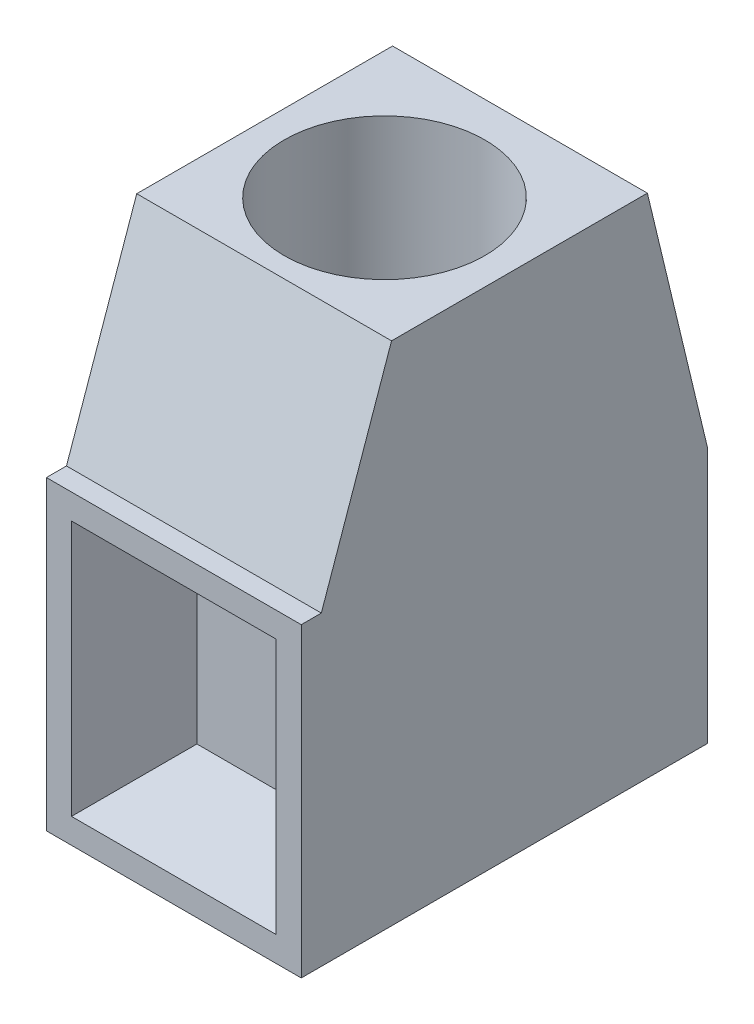
ISO-10303-21;
HEADER;
FILE_DESCRIPTION(('STEP AP214'),'2;1');
FILE_NAME('part.step','',(''),(''),'','','');
FILE_SCHEMA(('AUTOMOTIVE_DESIGN { 1 0 10303 214 1 1 1 1 }'));
ENDSEC;
DATA;
#1=APPLICATION_CONTEXT('core data for automotive mechanical design processes');
#2=APPLICATION_PROTOCOL_DEFINITION('international standard','automotive_design',2000,#1);
#3=PRODUCT_CONTEXT('',#1,'mechanical');
#4=PRODUCT('Part','Part','',(#3));
#5=PRODUCT_RELATED_PRODUCT_CATEGORY('part','',(#4));
#6=PRODUCT_DEFINITION_FORMATION('','',#4);
#7=PRODUCT_DEFINITION_CONTEXT('part definition',#1,'design');
#8=PRODUCT_DEFINITION('design','',#6,#7);
#9=PRODUCT_DEFINITION_SHAPE('','',#8);
#10=(LENGTH_UNIT() NAMED_UNIT(*) SI_UNIT(.MILLI.,.METRE.));
#11=(NAMED_UNIT(*) PLANE_ANGLE_UNIT() SI_UNIT($,.RADIAN.));
#12=(NAMED_UNIT(*) SI_UNIT($,.STERADIAN.) SOLID_ANGLE_UNIT());
#13=UNCERTAINTY_MEASURE_WITH_UNIT(LENGTH_MEASURE(1.E-05),#10,'distance_accuracy_value','');
#14=(GEOMETRIC_REPRESENTATION_CONTEXT(3) GLOBAL_UNCERTAINTY_ASSIGNED_CONTEXT((#13)) GLOBAL_UNIT_ASSIGNED_CONTEXT((#10,
#11,#12)) REPRESENTATION_CONTEXT('',''));
#15=CARTESIAN_POINT('',(0.,0.,0.));
#16=DIRECTION('',(0.,0.,1.));
#17=DIRECTION('',(1.,0.,0.));
#18=AXIS2_PLACEMENT_3D('',#15,#16,#17);
#19=CARTESIAN_POINT('',(2.54,6.1,-4.2));
#20=DIRECTION('',(0.,1.,0.));
#21=DIRECTION('',(0.,0.,1.));
#22=AXIS2_PLACEMENT_3D('',#19,#20,#21);
#23=PLANE('',#22);
#24=CARTESIAN_POINT('',(2.54,6.1,-4.2));
#25=DIRECTION('',(0.,-1.,0.));
#26=DIRECTION('',(0.,0.,-1.));
#27=AXIS2_PLACEMENT_3D('',#24,#25,#26);
#28=CIRCLE('',#27,1.9);
#29=CARTESIAN_POINT('',(3.42241293779472,6.1,-2.51733918830556));
#30=VERTEX_POINT('',#29);
#31=CARTESIAN_POINT('',(4.1545907069124,6.1,-3.1984527723799));
#32=VERTEX_POINT('',#31);
#33=EDGE_CURVE('E156',#30,#32,#28,.F.);
#34=ORIENTED_EDGE('',*,*,#33,.T.);
#35=DIRECTION('',(-0.681113584074246,0.,-0.732177769117265));
#36=VECTOR('',#35,1.);
#37=CARTESIAN_POINT('',(1.657587062206,6.1,-5.882660811695));
#38=LINE('',#37,#36);
#39=CARTESIAN_POINT('',(1.65758706220603,6.1,-5.88266081169497));
#40=VERTEX_POINT('',#39);
#41=EDGE_CURVE('E160',#32,#40,#38,.T.);
#42=ORIENTED_EDGE('',*,*,#41,.T.);
#43=CARTESIAN_POINT('',(2.54,6.1,-4.2));
#44=DIRECTION('',(0.,-1.,0.));
#45=DIRECTION('',(0.,0.,-1.));
#46=AXIS2_PLACEMENT_3D('',#43,#44,#45);
#47=CIRCLE('',#46,1.9);
#48=CARTESIAN_POINT('',(0.925409293088177,6.1,-5.20154722762081));
#49=VERTEX_POINT('',#48);
#50=EDGE_CURVE('E19',#40,#49,#47,.F.);
#51=ORIENTED_EDGE('',*,*,#50,.T.);
#52=DIRECTION('',(0.681113584074246,0.,0.732177769117265));
#53=VECTOR('',#52,1.);
#54=CARTESIAN_POINT('',(0.925409293088,6.1,-5.201547227621));
#55=LINE('',#54,#53);
#56=EDGE_CURVE('E173',#49,#30,#55,.T.);
#57=ORIENTED_EDGE('',*,*,#56,.T.);
#58=EDGE_LOOP('',(#34,#42,#51,#57));
#59=FACE_BOUND('',#58,.T.);
#60=ADVANCED_FACE('F16',(#59),#23,.T.);
#61=CARTESIAN_POINT('',(0.925409293088,6.1,-5.201547227621));
#62=DIRECTION('',(-0.732177769117265,0.,0.681113584074246));
#63=DIRECTION('',(0.681113584074246,0.,0.732177769117265));
#64=AXIS2_PLACEMENT_3D('',#61,#62,#63);
#65=PLANE('',#64);
#66=DIRECTION('',(0.,1.,0.));
#67=VECTOR('',#66,1.);
#68=CARTESIAN_POINT('',(3.42241293779467,6.1,-2.51733918830562));
#69=LINE('',#68,#67);
#70=CARTESIAN_POINT('',(3.4224129377943,7.1,-2.51733918830534));
#71=VERTEX_POINT('',#70);
#72=EDGE_CURVE('E168',#30,#71,#69,.T.);
#73=ORIENTED_EDGE('',*,*,#72,.F.);
#74=ORIENTED_EDGE('',*,*,#56,.F.);
#75=DIRECTION('',(0.,1.,0.));
#76=VECTOR('',#75,1.);
#77=CARTESIAN_POINT('',(0.925409293088,6.1,-5.201547227621));
#78=LINE('',#77,#76);
#79=CARTESIAN_POINT('',(0.925409293088177,7.1,-5.20154722762081));
#80=VERTEX_POINT('',#79);
#81=EDGE_CURVE('E151',#80,#49,#78,.F.);
#82=ORIENTED_EDGE('',*,*,#81,.F.);
#83=DIRECTION('',(-0.681113584074065,0.,-0.732177769117433));
#84=VECTOR('',#83,1.);
#85=CARTESIAN_POINT('',(3.422412937794,7.1,-2.517339188305));
#86=LINE('',#85,#84);
#87=EDGE_CURVE('E164',#71,#80,#86,.T.);
#88=ORIENTED_EDGE('',*,*,#87,.F.);
#89=EDGE_LOOP('',(#73,#74,#82,#88));
#90=FACE_BOUND('',#89,.T.);
#91=ADVANCED_FACE('F208',(#90),#65,.F.);
#92=CARTESIAN_POINT('',(1.657587062206,6.1,-5.882660811695));
#93=DIRECTION('',(0.732177769117265,0.,-0.681113584074246));
#94=DIRECTION('',(-0.681113584074246,0.,-0.732177769117265));
#95=AXIS2_PLACEMENT_3D('',#92,#93,#94);
#96=PLANE('',#95);
#97=DIRECTION('',(0.,1.,0.));
#98=VECTOR('',#97,1.);
#99=CARTESIAN_POINT('',(1.657587062206,6.1,-5.882660811695));
#100=LINE('',#99,#98);
#101=CARTESIAN_POINT('',(1.65758706220603,7.1,-5.88266081169497));
#102=VERTEX_POINT('',#101);
#103=EDGE_CURVE('E148',#40,#102,#100,.T.);
#104=ORIENTED_EDGE('',*,*,#103,.F.);
#105=ORIENTED_EDGE('',*,*,#41,.F.);
#106=DIRECTION('',(0.,1.,0.));
#107=VECTOR('',#106,1.);
#108=CARTESIAN_POINT('',(4.15459070691266,6.1,-3.19845277237962));
#109=LINE('',#108,#107);
#110=CARTESIAN_POINT('',(4.15459070691216,7.1,-3.1984527723795));
#111=VERTEX_POINT('',#110);
#112=EDGE_CURVE('E166',#111,#32,#109,.F.);
#113=ORIENTED_EDGE('',*,*,#112,.F.);
#114=DIRECTION('',(0.681113584074065,0.,0.732177769117433));
#115=VECTOR('',#114,1.);
#116=CARTESIAN_POINT('',(1.657587062206,7.1,-5.882660811695));
#117=LINE('',#116,#115);
#118=EDGE_CURVE('E163',#102,#111,#117,.T.);
#119=ORIENTED_EDGE('',*,*,#118,.F.);
#120=EDGE_LOOP('',(#104,#105,#113,#119));
#121=FACE_BOUND('',#120,.T.);
#122=ADVANCED_FACE('F159',(#121),#96,.F.);
#123=CARTESIAN_POINT('',(2.54,7.1,-4.2));
#124=DIRECTION('',(0.,1.,0.));
#125=DIRECTION('',(0.,0.,1.));
#126=AXIS2_PLACEMENT_3D('',#123,#124,#125);
#127=PLANE('',#126);
#128=CARTESIAN_POINT('',(2.54,7.1,-4.2));
#129=DIRECTION('',(0.,-1.,0.));
#130=DIRECTION('',(0.,0.,-1.));
#131=AXIS2_PLACEMENT_3D('',#128,#129,#130);
#132=CIRCLE('',#131,1.9);
#133=EDGE_CURVE('E193',#71,#80,#132,.T.);
#134=ORIENTED_EDGE('',*,*,#133,.F.);
#135=ORIENTED_EDGE('',*,*,#87,.T.);
#136=EDGE_LOOP('',(#134,#135));
#137=FACE_BOUND('',#136,.T.);
#138=ADVANCED_FACE('F210',(#137),#127,.T.);
#139=CARTESIAN_POINT('',(2.54,7.1,-4.2));
#140=DIRECTION('',(0.,1.,0.));
#141=DIRECTION('',(0.,0.,1.));
#142=AXIS2_PLACEMENT_3D('',#139,#140,#141);
#143=PLANE('',#142);
#144=CARTESIAN_POINT('',(2.54,7.1,-4.2));
#145=DIRECTION('',(0.,-1.,0.));
#146=DIRECTION('',(0.,0.,-1.));
#147=AXIS2_PLACEMENT_3D('',#144,#145,#146);
#148=CIRCLE('',#147,1.9);
#149=EDGE_CURVE('E190',#102,#111,#148,.T.);
#150=ORIENTED_EDGE('',*,*,#149,.F.);
#151=ORIENTED_EDGE('',*,*,#118,.T.);
#152=EDGE_LOOP('',(#150,#151));
#153=FACE_BOUND('',#152,.T.);
#154=ADVANCED_FACE('F212',(#153),#143,.T.);
#155=CARTESIAN_POINT('',(2.09,-2.,-3.9));
#156=DIRECTION('',(1.,0.,0.));
#157=DIRECTION('',(0.,0.,-1.));
#158=AXIS2_PLACEMENT_3D('',#155,#156,#157);
#159=PLANE('',#158);
#160=DIRECTION('',(0.,1.,0.));
#161=VECTOR('',#160,1.);
#162=CARTESIAN_POINT('',(2.09,-2.,-4.5));
#163=LINE('',#162,#161);
#164=CARTESIAN_POINT('',(2.09,0.,-4.5));
#165=VERTEX_POINT('',#164);
#166=CARTESIAN_POINT('',(2.09,-2.,-4.5));
#167=VERTEX_POINT('',#166);
#168=EDGE_CURVE('E192',#165,#167,#163,.F.);
#169=ORIENTED_EDGE('',*,*,#168,.T.);
#170=DIRECTION('',(0.,0.,-1.));
#171=VECTOR('',#170,1.);
#172=CARTESIAN_POINT('',(2.09,-2.,0.));
#173=LINE('',#172,#171);
#174=CARTESIAN_POINT('',(2.09,-2.,-3.9));
#175=VERTEX_POINT('',#174);
#176=EDGE_CURVE('E316',#175,#167,#173,.T.);
#177=ORIENTED_EDGE('',*,*,#176,.F.);
#178=DIRECTION('',(0.,1.,0.));
#179=VECTOR('',#178,1.);
#180=CARTESIAN_POINT('',(2.09,-2.,-3.9));
#181=LINE('',#180,#179);
#182=CARTESIAN_POINT('',(2.09,0.,-3.9));
#183=VERTEX_POINT('',#182);
#184=EDGE_CURVE('E328',#175,#183,#181,.T.);
#185=ORIENTED_EDGE('',*,*,#184,.T.);
#186=DIRECTION('',(0.,0.,-1.));
#187=VECTOR('',#186,1.);
#188=CARTESIAN_POINT('',(2.09,0.,-3.9));
#189=LINE('',#188,#187);
#190=EDGE_CURVE('E194',#165,#183,#189,.F.);
#191=ORIENTED_EDGE('',*,*,#190,.F.);
#192=EDGE_LOOP('',(#169,#177,#185,#191));
#193=FACE_BOUND('',#192,.T.);
#194=ADVANCED_FACE('F219',(#193),#159,.F.);
#195=CARTESIAN_POINT('',(2.54,7.1,-4.2));
#196=DIRECTION('',(0.,-1.,0.));
#197=DIRECTION('',(0.,0.,-1.));
#198=AXIS2_PLACEMENT_3D('',#195,#196,#197);
#199=CYLINDRICAL_SURFACE('',#198,1.9);
#200=CARTESIAN_POINT('',(2.54,4.1,-4.2));
#201=DIRECTION('',(0.,-1.,0.));
#202=DIRECTION('',(0.,0.,-1.));
#203=AXIS2_PLACEMENT_3D('',#200,#201,#202);
#204=CIRCLE('',#203,1.9);
#205=CARTESIAN_POINT('',(2.54,4.1,-6.1));
#206=VERTEX_POINT('',#205);
#207=EDGE_CURVE('E185',#206,#206,#204,.T.);
#208=ORIENTED_EDGE('',*,*,#207,.F.);
#209=EDGE_LOOP('',(#208));
#210=FACE_BOUND('',#209,.T.);
#211=ORIENTED_EDGE('',*,*,#33,.F.);
#212=ORIENTED_EDGE('',*,*,#72,.T.);
#213=ORIENTED_EDGE('',*,*,#133,.T.);
#214=ORIENTED_EDGE('',*,*,#81,.T.);
#215=ORIENTED_EDGE('',*,*,#50,.F.);
#216=ORIENTED_EDGE('',*,*,#103,.T.);
#217=ORIENTED_EDGE('',*,*,#149,.T.);
#218=ORIENTED_EDGE('',*,*,#112,.T.);
#219=EDGE_LOOP('',(#211,#212,#213,#214,#215,#216,#217,#218));
#220=FACE_BOUND('',#219,.T.);
#221=ADVANCED_FACE('F146',(#210,#220),#199,.T.);
#222=CARTESIAN_POINT('',(0.,0.,-2.));
#223=DIRECTION('',(0.,0.,1.));
#224=DIRECTION('',(1.,0.,0.));
#225=AXIS2_PLACEMENT_3D('',#222,#223,#224);
#226=PLANE('',#225);
#227=DIRECTION('',(0.,1.,0.));
#228=VECTOR('',#227,1.);
#229=CARTESIAN_POINT('',(1.,0.,-2.));
#230=LINE('',#229,#228);
#231=CARTESIAN_POINT('',(1.,5.1,-2.));
#232=VERTEX_POINT('',#231);
#233=CARTESIAN_POINT('',(1.,1.,-2.));
#234=VERTEX_POINT('',#233);
#235=EDGE_CURVE('E359',#232,#234,#230,.F.);
#236=ORIENTED_EDGE('',*,*,#235,.T.);
#237=DIRECTION('',(1.,0.,0.));
#238=VECTOR('',#237,1.);
#239=CARTESIAN_POINT('',(0.,1.,-2.));
#240=LINE('',#239,#238);
#241=CARTESIAN_POINT('',(4.08,1.,-2.));
#242=VERTEX_POINT('',#241);
#243=EDGE_CURVE('E356',#234,#242,#240,.T.);
#244=ORIENTED_EDGE('',*,*,#243,.T.);
#245=DIRECTION('',(0.,1.,0.));
#246=VECTOR('',#245,1.);
#247=CARTESIAN_POINT('',(4.08,0.,-2.));
#248=LINE('',#247,#246);
#249=CARTESIAN_POINT('',(4.08,5.1,-2.));
#250=VERTEX_POINT('',#249);
#251=EDGE_CURVE('E350',#242,#250,#248,.T.);
#252=ORIENTED_EDGE('',*,*,#251,.T.);
#253=DIRECTION('',(1.,0.,0.));
#254=VECTOR('',#253,1.);
#255=CARTESIAN_POINT('',(0.,5.1,-2.));
#256=LINE('',#255,#254);
#257=EDGE_CURVE('E188',#250,#232,#256,.F.);
#258=ORIENTED_EDGE('',*,*,#257,.T.);
#259=EDGE_LOOP('',(#236,#244,#252,#258));
#260=FACE_BOUND('',#259,.T.);
#261=ADVANCED_FACE('F300',(#260),#226,.T.);
#262=CARTESIAN_POINT('',(2.09,-2.,-4.5));
#263=DIRECTION('',(0.,0.,1.));
#264=DIRECTION('',(1.,0.,0.));
#265=AXIS2_PLACEMENT_3D('',#262,#263,#264);
#266=PLANE('',#265);
#267=DIRECTION('',(0.,1.,0.));
#268=VECTOR('',#267,1.);
#269=CARTESIAN_POINT('',(2.99,-2.,-4.5));
#270=LINE('',#269,#268);
#271=CARTESIAN_POINT('',(2.99,0.,-4.5));
#272=VERTEX_POINT('',#271);
#273=CARTESIAN_POINT('',(2.99,-2.,-4.5));
#274=VERTEX_POINT('',#273);
#275=EDGE_CURVE('E322',#272,#274,#270,.F.);
#276=ORIENTED_EDGE('',*,*,#275,.T.);
#277=DIRECTION('',(1.,0.,0.));
#278=VECTOR('',#277,1.);
#279=CARTESIAN_POINT('',(0.,-2.,-4.5));
#280=LINE('',#279,#278);
#281=EDGE_CURVE('E320',#167,#274,#280,.T.);
#282=ORIENTED_EDGE('',*,*,#281,.F.);
#283=ORIENTED_EDGE('',*,*,#168,.F.);
#284=DIRECTION('',(1.,0.,0.));
#285=VECTOR('',#284,1.);
#286=CARTESIAN_POINT('',(2.09,0.,-4.5));
#287=LINE('',#286,#285);
#288=EDGE_CURVE('E318',#272,#165,#287,.F.);
#289=ORIENTED_EDGE('',*,*,#288,.F.);
#290=EDGE_LOOP('',(#276,#282,#283,#289));
#291=FACE_BOUND('',#290,.T.);
#292=ADVANCED_FACE('F296',(#291),#266,.F.);
#293=CARTESIAN_POINT('',(0.,-2.,0.));
#294=DIRECTION('',(0.,-1.,0.));
#295=DIRECTION('',(0.,0.,-1.));
#296=AXIS2_PLACEMENT_3D('',#293,#294,#295);
#297=PLANE('',#296);
#298=DIRECTION('',(0.,0.,1.));
#299=VECTOR('',#298,1.);
#300=CARTESIAN_POINT('',(2.99,-2.,-3.9));
#301=LINE('',#300,#299);
#302=CARTESIAN_POINT('',(2.99,-2.,-3.9));
#303=VERTEX_POINT('',#302);
#304=EDGE_CURVE('E337',#274,#303,#301,.T.);
#305=ORIENTED_EDGE('',*,*,#304,.T.);
#306=DIRECTION('',(-1.,0.,0.));
#307=VECTOR('',#306,1.);
#308=CARTESIAN_POINT('',(2.09,-2.,-3.9));
#309=LINE('',#308,#307);
#310=EDGE_CURVE('E325',#303,#175,#309,.T.);
#311=ORIENTED_EDGE('',*,*,#310,.T.);
#312=ORIENTED_EDGE('',*,*,#176,.T.);
#313=ORIENTED_EDGE('',*,*,#281,.T.);
#314=EDGE_LOOP('',(#305,#311,#312,#313));
#315=FACE_BOUND('',#314,.T.);
#316=ADVANCED_FACE('F292',(#315),#297,.T.);
#317=CARTESIAN_POINT('',(2.09,-2.,-3.9));
#318=DIRECTION('',(0.,0.,-1.));
#319=DIRECTION('',(-1.,0.,0.));
#320=AXIS2_PLACEMENT_3D('',#317,#318,#319);
#321=PLANE('',#320);
#322=ORIENTED_EDGE('',*,*,#184,.F.);
#323=ORIENTED_EDGE('',*,*,#310,.F.);
#324=DIRECTION('',(0.,1.,0.));
#325=VECTOR('',#324,1.);
#326=CARTESIAN_POINT('',(2.99,-2.,-3.9));
#327=LINE('',#326,#325);
#328=CARTESIAN_POINT('',(2.99,0.,-3.9));
#329=VERTEX_POINT('',#328);
#330=EDGE_CURVE('E184',#303,#329,#327,.T.);
#331=ORIENTED_EDGE('',*,*,#330,.T.);
#332=DIRECTION('',(-1.,0.,0.));
#333=VECTOR('',#332,1.);
#334=CARTESIAN_POINT('',(2.09,0.,-3.9));
#335=LINE('',#334,#333);
#336=EDGE_CURVE('E189',#183,#329,#335,.F.);
#337=ORIENTED_EDGE('',*,*,#336,.F.);
#338=EDGE_LOOP('',(#322,#323,#331,#337));
#339=FACE_BOUND('',#338,.T.);
#340=ADVANCED_FACE('F288',(#339),#321,.F.);
#341=CARTESIAN_POINT('',(2.54,4.1,-4.2));
#342=DIRECTION('',(0.,1.,0.));
#343=DIRECTION('',(0.,0.,1.));
#344=AXIS2_PLACEMENT_3D('',#341,#342,#343);
#345=PLANE('',#344);
#346=ORIENTED_EDGE('',*,*,#207,.T.);
#347=EDGE_LOOP('',(#346));
#348=FACE_BOUND('',#347,.T.);
#349=CARTESIAN_POINT('',(2.54,4.1,-4.2));
#350=DIRECTION('',(0.,1.,0.));
#351=DIRECTION('',(0.,0.,1.));
#352=AXIS2_PLACEMENT_3D('',#349,#350,#351);
#353=CIRCLE('',#352,2.);
#354=CARTESIAN_POINT('',(2.54,4.1,-2.2));
#355=VERTEX_POINT('',#354);
#356=EDGE_CURVE('E180',#355,#355,#353,.T.);
#357=ORIENTED_EDGE('',*,*,#356,.T.);
#358=EDGE_LOOP('',(#357));
#359=FACE_BOUND('',#358,.T.);
#360=ADVANCED_FACE('F284',(#348,#359),#345,.T.);
#361=CARTESIAN_POINT('',(0.,5.1,-2.));
#362=DIRECTION('',(0.,0.970142500145391,-0.242535625036098));
#363=DIRECTION('',(0.,0.242535625036098,0.970142500145391));
#364=AXIS2_PLACEMENT_3D('',#361,#362,#363);
#365=PLANE('',#364);
#366=DIRECTION('',(-1.,0.,0.));
#367=VECTOR('',#366,1.);
#368=CARTESIAN_POINT('',(0.,5.6,0.));
#369=LINE('',#368,#367);
#370=CARTESIAN_POINT('',(4.57999999999988,5.59999999999976,0.));
#371=VERTEX_POINT('',#370);
#372=CARTESIAN_POINT('',(0.500000000000122,5.59999999999976,0.));
#373=VERTEX_POINT('',#372);
#374=EDGE_CURVE('E374',#371,#373,#369,.T.);
#375=ORIENTED_EDGE('',*,*,#374,.T.);
#376=DIRECTION('',(0.235702260395287,-0.235702260395516,-0.942809041582121));
#377=VECTOR('',#376,1.);
#378=CARTESIAN_POINT('',(0.500000000000485,5.6,1.21976370917076E-13));
#379=LINE('',#378,#377);
#380=EDGE_CURVE('E362',#373,#232,#379,.T.);
#381=ORIENTED_EDGE('',*,*,#380,.T.);
#382=ORIENTED_EDGE('',*,*,#257,.F.);
#383=DIRECTION('',(0.235702260395287,0.235702260395516,0.942809041582121));
#384=VECTOR('',#383,1.);
#385=CARTESIAN_POINT('',(4.08,5.1,-2.));
#386=LINE('',#385,#384);
#387=EDGE_CURVE('E347',#250,#371,#386,.T.);
#388=ORIENTED_EDGE('',*,*,#387,.T.);
#389=EDGE_LOOP('',(#375,#381,#382,#388));
#390=FACE_BOUND('',#389,.T.);
#391=ADVANCED_FACE('F280',(#390),#365,.F.);
#392=CARTESIAN_POINT('',(1.,0.,-2.));
#393=DIRECTION('',(-0.970142500145391,0.,-0.242535625036098));
#394=DIRECTION('',(-0.242535625036098,0.,0.970142500145391));
#395=AXIS2_PLACEMENT_3D('',#392,#393,#394);
#396=PLANE('',#395);
#397=ORIENTED_EDGE('',*,*,#235,.F.);
#398=ORIENTED_EDGE('',*,*,#380,.F.);
#399=DIRECTION('',(0.,1.,0.));
#400=VECTOR('',#399,1.);
#401=CARTESIAN_POINT('',(0.5,10.1,0.));
#402=LINE('',#401,#400);
#403=CARTESIAN_POINT('',(0.500000000000242,0.500000000000121,0.));
#404=VERTEX_POINT('',#403);
#405=EDGE_CURVE('E377',#373,#404,#402,.F.);
#406=ORIENTED_EDGE('',*,*,#405,.T.);
#407=DIRECTION('',(0.235702260395516,0.235702260395287,-0.942809041582121));
#408=VECTOR('',#407,1.);
#409=CARTESIAN_POINT('',(0.5,0.500000000000485,1.22298005056365E-13));
#410=LINE('',#409,#408);
#411=EDGE_CURVE('E353',#404,#234,#410,.T.);
#412=ORIENTED_EDGE('',*,*,#411,.T.);
#413=EDGE_LOOP('',(#397,#398,#406,#412));
#414=FACE_BOUND('',#413,.T.);
#415=ADVANCED_FACE('F276',(#414),#396,.F.);
#416=CARTESIAN_POINT('',(0.,1.,-2.));
#417=DIRECTION('',(0.,-0.970142500145391,-0.242535625036098));
#418=DIRECTION('',(0.,0.242535625036098,-0.970142500145391));
#419=AXIS2_PLACEMENT_3D('',#416,#417,#418);
#420=PLANE('',#419);
#421=DIRECTION('',(-1.,0.,0.));
#422=VECTOR('',#421,1.);
#423=CARTESIAN_POINT('',(0.,0.5,0.));
#424=LINE('',#423,#422);
#425=CARTESIAN_POINT('',(4.57999999999988,0.500000000000243,0.));
#426=VERTEX_POINT('',#425);
#427=EDGE_CURVE('E380',#404,#426,#424,.F.);
#428=ORIENTED_EDGE('',*,*,#427,.T.);
#429=DIRECTION('',(-0.235702260395287,0.235702260395516,-0.942809041582121));
#430=VECTOR('',#429,1.);
#431=CARTESIAN_POINT('',(4.57999999999952,0.5,1.21410634973786E-13));
#432=LINE('',#431,#430);
#433=EDGE_CURVE('E341',#426,#242,#432,.T.);
#434=ORIENTED_EDGE('',*,*,#433,.T.);
#435=ORIENTED_EDGE('',*,*,#243,.F.);
#436=ORIENTED_EDGE('',*,*,#411,.F.);
#437=EDGE_LOOP('',(#428,#434,#435,#436));
#438=FACE_BOUND('',#437,.T.);
#439=ADVANCED_FACE('F272',(#438),#420,.F.);
#440=CARTESIAN_POINT('',(4.08,0.,-2.));
#441=DIRECTION('',(0.970142500145391,0.,-0.242535625036098));
#442=DIRECTION('',(-0.242535625036098,0.,-0.970142500145391));
#443=AXIS2_PLACEMENT_3D('',#440,#441,#442);
#444=PLANE('',#443);
#445=DIRECTION('',(0.,1.,0.));
#446=VECTOR('',#445,1.);
#447=CARTESIAN_POINT('',(4.58,10.1,0.));
#448=LINE('',#447,#446);
#449=EDGE_CURVE('E383',#426,#371,#448,.T.);
#450=ORIENTED_EDGE('',*,*,#449,.T.);
#451=ORIENTED_EDGE('',*,*,#387,.F.);
#452=ORIENTED_EDGE('',*,*,#251,.F.);
#453=ORIENTED_EDGE('',*,*,#433,.F.);
#454=EDGE_LOOP('',(#450,#451,#452,#453));
#455=FACE_BOUND('',#454,.T.);
#456=ADVANCED_FACE('F268',(#455),#444,.F.);
#457=CARTESIAN_POINT('',(0.,6.1,-0.4));
#458=DIRECTION('',(0.,-1.,0.));
#459=DIRECTION('',(0.,0.,-1.));
#460=AXIS2_PLACEMENT_3D('',#457,#458,#459);
#461=PLANE('',#460);
#462=DIRECTION('',(0.,0.,1.));
#463=VECTOR('',#462,1.);
#464=CARTESIAN_POINT('',(5.08,6.1,0.));
#465=LINE('',#464,#463);
#466=CARTESIAN_POINT('',(5.08,6.1,0.));
#467=VERTEX_POINT('',#466);
#468=CARTESIAN_POINT('',(5.08,6.1,-0.4));
#469=VERTEX_POINT('',#468);
#470=EDGE_CURVE('E183',#467,#469,#465,.F.);
#471=ORIENTED_EDGE('',*,*,#470,.T.);
#472=DIRECTION('',(1.,0.,0.));
#473=VECTOR('',#472,1.);
#474=CARTESIAN_POINT('',(0.,6.1,-0.4));
#475=LINE('',#474,#473);
#476=CARTESIAN_POINT('',(0.,6.1,-0.4));
#477=VERTEX_POINT('',#476);
#478=EDGE_CURVE('E371',#477,#469,#475,.T.);
#479=ORIENTED_EDGE('',*,*,#478,.F.);
#480=DIRECTION('',(0.,0.,-1.));
#481=VECTOR('',#480,1.);
#482=CARTESIAN_POINT('',(0.,6.1,-0.4));
#483=LINE('',#482,#481);
#484=CARTESIAN_POINT('',(0.,6.1,0.));
#485=VERTEX_POINT('',#484);
#486=EDGE_CURVE('E338',#485,#477,#483,.T.);
#487=ORIENTED_EDGE('',*,*,#486,.F.);
#488=DIRECTION('',(-1.,0.,0.));
#489=VECTOR('',#488,1.);
#490=CARTESIAN_POINT('',(0.,6.1,0.));
#491=LINE('',#490,#489);
#492=EDGE_CURVE('E386',#485,#467,#491,.F.);
#493=ORIENTED_EDGE('',*,*,#492,.T.);
#494=EDGE_LOOP('',(#471,#479,#487,#493));
#495=FACE_BOUND('',#494,.T.);
#496=ADVANCED_FACE('F264',(#495),#461,.F.);
#497=CARTESIAN_POINT('',(2.99,-2.,-3.9));
#498=DIRECTION('',(-1.,0.,0.));
#499=DIRECTION('',(0.,0.,1.));
#500=AXIS2_PLACEMENT_3D('',#497,#498,#499);
#501=PLANE('',#500);
#502=ORIENTED_EDGE('',*,*,#330,.F.);
#503=ORIENTED_EDGE('',*,*,#304,.F.);
#504=ORIENTED_EDGE('',*,*,#275,.F.);
#505=DIRECTION('',(0.,0.,-1.));
#506=VECTOR('',#505,1.);
#507=CARTESIAN_POINT('',(2.99,0.,0.));
#508=LINE('',#507,#506);
#509=EDGE_CURVE('E335',#329,#272,#508,.T.);
#510=ORIENTED_EDGE('',*,*,#509,.F.);
#511=EDGE_LOOP('',(#502,#503,#504,#510));
#512=FACE_BOUND('',#511,.T.);
#513=ADVANCED_FACE('F260',(#512),#501,.F.);
#514=CARTESIAN_POINT('',(2.54,4.1,-4.2));
#515=DIRECTION('',(0.,1.,0.));
#516=DIRECTION('',(0.,0.,1.));
#517=AXIS2_PLACEMENT_3D('',#514,#515,#516);
#518=CYLINDRICAL_SURFACE('',#517,2.);
#519=ORIENTED_EDGE('',*,*,#356,.F.);
#520=EDGE_LOOP('',(#519));
#521=FACE_BOUND('',#520,.T.);
#522=CARTESIAN_POINT('',(2.54,10.1,-4.2));
#523=DIRECTION('',(0.,1.,0.));
#524=DIRECTION('',(0.,0.,1.));
#525=AXIS2_PLACEMENT_3D('',#522,#523,#524);
#526=CIRCLE('',#525,2.);
#527=CARTESIAN_POINT('',(2.54,10.1,-2.2));
#528=VERTEX_POINT('',#527);
#529=EDGE_CURVE('E175',#528,#528,#526,.T.);
#530=ORIENTED_EDGE('',*,*,#529,.T.);
#531=EDGE_LOOP('',(#530));
#532=FACE_BOUND('',#531,.T.);
#533=ADVANCED_FACE('F256',(#521,#532),#518,.F.);
#534=CARTESIAN_POINT('',(5.08,10.1,0.));
#535=DIRECTION('',(-1.,0.,0.));
#536=DIRECTION('',(0.,0.,1.));
#537=AXIS2_PLACEMENT_3D('',#534,#535,#536);
#538=PLANE('',#537);
#539=DIRECTION('',(0.,-0.972387301980617,-0.233372952474908));
#540=VECTOR('',#539,1.);
#541=CARTESIAN_POINT('',(5.08,10.1,-6.9));
#542=LINE('',#541,#540);
#543=CARTESIAN_POINT('',(5.08,5.09999999999987,-8.09999999999946));
#544=VERTEX_POINT('',#543);
#545=CARTESIAN_POINT('',(5.08,10.1,-6.9));
#546=VERTEX_POINT('',#545);
#547=EDGE_CURVE('E179',#544,#546,#542,.F.);
#548=ORIENTED_EDGE('',*,*,#547,.T.);
#549=DIRECTION('',(0.,0.,-1.));
#550=VECTOR('',#549,1.);
#551=CARTESIAN_POINT('',(5.08,10.1,0.));
#552=LINE('',#551,#550);
#553=CARTESIAN_POINT('',(5.08,10.1000000000001,-1.79999999999981));
#554=VERTEX_POINT('',#553);
#555=EDGE_CURVE('E409',#546,#554,#552,.F.);
#556=ORIENTED_EDGE('',*,*,#555,.T.);
#557=DIRECTION('',(0.,-0.943858356366049,0.330350424728017));
#558=VECTOR('',#557,1.);
#559=CARTESIAN_POINT('',(5.08,6.1,-0.4));
#560=LINE('',#559,#558);
#561=EDGE_CURVE('E369',#469,#554,#560,.F.);
#562=ORIENTED_EDGE('',*,*,#561,.F.);
#563=ORIENTED_EDGE('',*,*,#470,.F.);
#564=DIRECTION('',(0.,1.,0.));
#565=VECTOR('',#564,1.);
#566=CARTESIAN_POINT('',(5.08,10.1,0.));
#567=LINE('',#566,#565);
#568=CARTESIAN_POINT('',(5.08,0.,0.));
#569=VERTEX_POINT('',#568);
#570=EDGE_CURVE('E389',#467,#569,#567,.F.);
#571=ORIENTED_EDGE('',*,*,#570,.T.);
#572=DIRECTION('',(0.,0.,-1.));
#573=VECTOR('',#572,1.);
#574=CARTESIAN_POINT('',(5.08,0.,0.));
#575=LINE('',#574,#573);
#576=CARTESIAN_POINT('',(5.08,0.,-8.1));
#577=VERTEX_POINT('',#576);
#578=EDGE_CURVE('E392',#577,#569,#575,.F.);
#579=ORIENTED_EDGE('',*,*,#578,.F.);
#580=DIRECTION('',(0.,1.,0.));
#581=VECTOR('',#580,1.);
#582=CARTESIAN_POINT('',(5.08,10.1,-8.1));
#583=LINE('',#582,#581);
#584=EDGE_CURVE('E400',#577,#544,#583,.T.);
#585=ORIENTED_EDGE('',*,*,#584,.T.);
#586=EDGE_LOOP('',(#548,#556,#562,#563,#571,#579,#585));
#587=FACE_BOUND('',#586,.T.);
#588=ADVANCED_FACE('F252',(#587),#538,.F.);
#589=CARTESIAN_POINT('',(0.,6.1,-0.4));
#590=DIRECTION('',(0.,0.330350424728017,0.943858356366049));
#591=DIRECTION('',(0.,-0.943858356366049,0.330350424728017));
#592=AXIS2_PLACEMENT_3D('',#589,#590,#591);
#593=PLANE('',#592);
#594=DIRECTION('',(0.,-0.943858356366017,0.330350424728106));
#595=VECTOR('',#594,1.);
#596=CARTESIAN_POINT('',(0.,10.1,-1.8));
#597=LINE('',#596,#595);
#598=CARTESIAN_POINT('',(0.,10.1000000000001,-1.79999999999981));
#599=VERTEX_POINT('',#598);
#600=EDGE_CURVE('E412',#599,#477,#597,.T.);
#601=ORIENTED_EDGE('',*,*,#600,.T.);
#602=ORIENTED_EDGE('',*,*,#478,.T.);
#603=ORIENTED_EDGE('',*,*,#561,.T.);
#604=DIRECTION('',(1.,0.,0.));
#605=VECTOR('',#604,1.);
#606=CARTESIAN_POINT('',(0.,10.1,-1.8));
#607=LINE('',#606,#605);
#608=EDGE_CURVE('E178',#554,#599,#607,.F.);
#609=ORIENTED_EDGE('',*,*,#608,.T.);
#610=EDGE_LOOP('',(#601,#602,#603,#609));
#611=FACE_BOUND('',#610,.T.);
#612=ADVANCED_FACE('F248',(#611),#593,.T.);
#613=CARTESIAN_POINT('',(0.,10.1,0.));
#614=DIRECTION('',(0.,0.,-1.));
#615=DIRECTION('',(-1.,0.,0.));
#616=AXIS2_PLACEMENT_3D('',#613,#614,#615);
#617=PLANE('',#616);
#618=ORIENTED_EDGE('',*,*,#492,.F.);
#619=DIRECTION('',(0.,1.,0.));
#620=VECTOR('',#619,1.);
#621=CARTESIAN_POINT('',(0.,10.1,0.));
#622=LINE('',#621,#620);
#623=CARTESIAN_POINT('',(0.,0.,0.));
#624=VERTEX_POINT('',#623);
#625=EDGE_CURVE('E415',#485,#624,#622,.F.);
#626=ORIENTED_EDGE('',*,*,#625,.T.);
#627=DIRECTION('',(1.,0.,0.));
#628=VECTOR('',#627,1.);
#629=CARTESIAN_POINT('',(0.,0.,0.));
#630=LINE('',#629,#628);
#631=EDGE_CURVE('E394',#569,#624,#630,.F.);
#632=ORIENTED_EDGE('',*,*,#631,.F.);
#633=ORIENTED_EDGE('',*,*,#570,.F.);
#634=EDGE_LOOP('',(#618,#626,#632,#633));
#635=FACE_BOUND('',#634,.T.);
#636=ORIENTED_EDGE('',*,*,#427,.F.);
#637=ORIENTED_EDGE('',*,*,#405,.F.);
#638=ORIENTED_EDGE('',*,*,#374,.F.);
#639=ORIENTED_EDGE('',*,*,#449,.F.);
#640=EDGE_LOOP('',(#636,#637,#638,#639));
#641=FACE_BOUND('',#640,.T.);
#642=ADVANCED_FACE('F245',(#635,#641),#617,.F.);
#643=CARTESIAN_POINT('',(0.,0.,0.));
#644=DIRECTION('',(0.,-1.,0.));
#645=DIRECTION('',(0.,0.,-1.));
#646=AXIS2_PLACEMENT_3D('',#643,#644,#645);
#647=PLANE('',#646);
#648=ORIENTED_EDGE('',*,*,#336,.T.);
#649=ORIENTED_EDGE('',*,*,#509,.T.);
#650=ORIENTED_EDGE('',*,*,#288,.T.);
#651=ORIENTED_EDGE('',*,*,#190,.T.);
#652=EDGE_LOOP('',(#648,#649,#650,#651));
#653=FACE_BOUND('',#652,.T.);
#654=ORIENTED_EDGE('',*,*,#578,.T.);
#655=ORIENTED_EDGE('',*,*,#631,.T.);
#656=DIRECTION('',(0.,0.,-1.));
#657=VECTOR('',#656,1.);
#658=CARTESIAN_POINT('',(0.,0.,0.));
#659=LINE('',#658,#657);
#660=CARTESIAN_POINT('',(0.,0.,-8.1));
#661=VERTEX_POINT('',#660);
#662=EDGE_CURVE('E418',#624,#661,#659,.T.);
#663=ORIENTED_EDGE('',*,*,#662,.T.);
#664=DIRECTION('',(1.,0.,0.));
#665=VECTOR('',#664,1.);
#666=CARTESIAN_POINT('',(0.,0.,-8.1));
#667=LINE('',#666,#665);
#668=EDGE_CURVE('E397',#661,#577,#667,.T.);
#669=ORIENTED_EDGE('',*,*,#668,.T.);
#670=EDGE_LOOP('',(#654,#655,#663,#669));
#671=FACE_BOUND('',#670,.T.);
#672=ADVANCED_FACE('F241',(#653,#671),#647,.T.);
#673=CARTESIAN_POINT('',(0.,10.1,-8.1));
#674=DIRECTION('',(0.,0.,1.));
#675=DIRECTION('',(1.,0.,0.));
#676=AXIS2_PLACEMENT_3D('',#673,#674,#675);
#677=PLANE('',#676);
#678=DIRECTION('',(1.,0.,0.));
#679=VECTOR('',#678,1.);
#680=CARTESIAN_POINT('',(0.,5.09999999999949,-8.09999999999786));
#681=LINE('',#680,#679);
#682=CARTESIAN_POINT('',(0.,5.09999999999987,-8.09999999999946));
#683=VERTEX_POINT('',#682);
#684=EDGE_CURVE('E402',#683,#544,#681,.T.);
#685=ORIENTED_EDGE('',*,*,#684,.T.);
#686=ORIENTED_EDGE('',*,*,#584,.F.);
#687=ORIENTED_EDGE('',*,*,#668,.F.);
#688=DIRECTION('',(0.,1.,0.));
#689=VECTOR('',#688,1.);
#690=CARTESIAN_POINT('',(0.,10.1,-8.1));
#691=LINE('',#690,#689);
#692=EDGE_CURVE('E421',#661,#683,#691,.T.);
#693=ORIENTED_EDGE('',*,*,#692,.T.);
#694=EDGE_LOOP('',(#685,#686,#687,#693));
#695=FACE_BOUND('',#694,.T.);
#696=ADVANCED_FACE('F237',(#695),#677,.F.);
#697=CARTESIAN_POINT('',(0.,10.1,-6.9));
#698=DIRECTION('',(0.,-0.233372952474908,0.972387301980617));
#699=DIRECTION('',(0.,-0.972387301980617,-0.233372952474908));
#700=AXIS2_PLACEMENT_3D('',#697,#698,#699);
#701=PLANE('',#700);
#702=ORIENTED_EDGE('',*,*,#684,.F.);
#703=DIRECTION('',(0.,0.972387301980517,0.233372952475324));
#704=VECTOR('',#703,1.);
#705=CARTESIAN_POINT('',(0.,5.1,-8.1));
#706=LINE('',#705,#704);
#707=CARTESIAN_POINT('',(0.,10.1,-6.9));
#708=VERTEX_POINT('',#707);
#709=EDGE_CURVE('E25',#683,#708,#706,.T.);
#710=ORIENTED_EDGE('',*,*,#709,.T.);
#711=DIRECTION('',(1.,0.,0.));
#712=VECTOR('',#711,1.);
#713=CARTESIAN_POINT('',(0.,10.1,-6.9));
#714=LINE('',#713,#712);
#715=EDGE_CURVE('E33',#708,#546,#714,.T.);
#716=ORIENTED_EDGE('',*,*,#715,.T.);
#717=ORIENTED_EDGE('',*,*,#547,.F.);
#718=EDGE_LOOP('',(#702,#710,#716,#717));
#719=FACE_BOUND('',#718,.T.);
#720=ADVANCED_FACE('F231',(#719),#701,.F.);
#721=CARTESIAN_POINT('',(0.,10.1,0.));
#722=DIRECTION('',(0.,-1.,0.));
#723=DIRECTION('',(0.,0.,-1.));
#724=AXIS2_PLACEMENT_3D('',#721,#722,#723);
#725=PLANE('',#724);
#726=ORIENTED_EDGE('',*,*,#715,.F.);
#727=DIRECTION('',(0.,0.,-1.));
#728=VECTOR('',#727,1.);
#729=CARTESIAN_POINT('',(0.,10.1,0.));
#730=LINE('',#729,#728);
#731=EDGE_CURVE('E11',#708,#599,#730,.F.);
#732=ORIENTED_EDGE('',*,*,#731,.T.);
#733=ORIENTED_EDGE('',*,*,#608,.F.);
#734=ORIENTED_EDGE('',*,*,#555,.F.);
#735=EDGE_LOOP('',(#726,#732,#733,#734));
#736=FACE_BOUND('',#735,.T.);
#737=ORIENTED_EDGE('',*,*,#529,.F.);
#738=EDGE_LOOP('',(#737));
#739=FACE_BOUND('',#738,.T.);
#740=ADVANCED_FACE('F225',(#736,#739),#725,.F.);
#741=CARTESIAN_POINT('',(0.,10.1,0.));
#742=DIRECTION('',(1.,0.,0.));
#743=DIRECTION('',(0.,0.,-1.));
#744=AXIS2_PLACEMENT_3D('',#741,#742,#743);
#745=PLANE('',#744);
#746=ORIENTED_EDGE('',*,*,#709,.F.);
#747=ORIENTED_EDGE('',*,*,#692,.F.);
#748=ORIENTED_EDGE('',*,*,#662,.F.);
#749=ORIENTED_EDGE('',*,*,#625,.F.);
#750=ORIENTED_EDGE('',*,*,#486,.T.);
#751=ORIENTED_EDGE('',*,*,#600,.F.);
#752=ORIENTED_EDGE('',*,*,#731,.F.);
#753=EDGE_LOOP('',(#746,#747,#748,#749,#750,#751,#752));
#754=FACE_BOUND('',#753,.T.);
#755=ADVANCED_FACE('F223',(#754),#745,.F.);
#756=CLOSED_SHELL('',(#60,#91,#122,#138,#154,#194,#221,#261,#292,#316,#340,#360,#391,#415,#439,
#456,#496,#513,#533,#588,#612,#642,#672,#696,#720,#740,#755));
#757=MANIFOLD_SOLID_BREP('B1',#756);
#758=ADVANCED_BREP_SHAPE_REPRESENTATION('',(#18,#757),#14);
#759=SHAPE_DEFINITION_REPRESENTATION(#9,#758);
ENDSEC;
END-ISO-10303-21;
